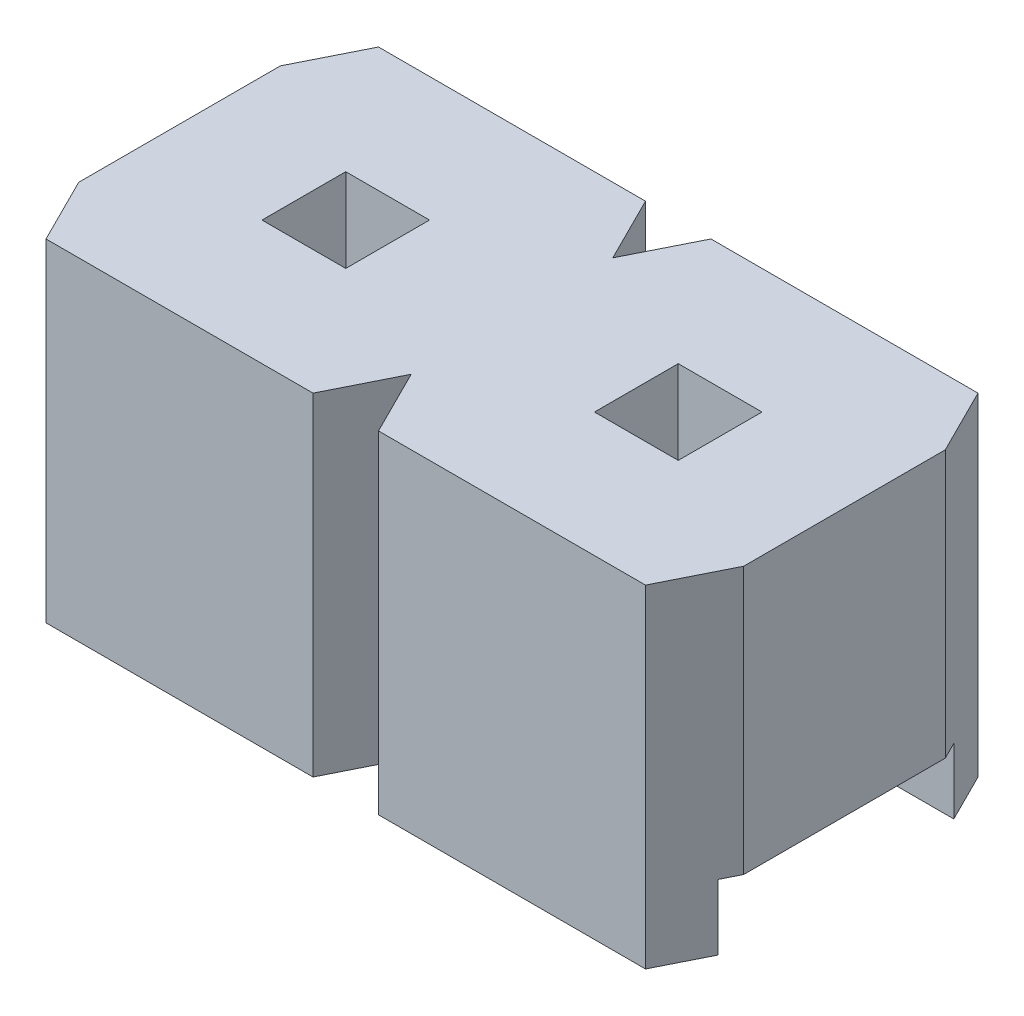
ISO-10303-21;
HEADER;
FILE_DESCRIPTION(('STEP AP214'),'2;1');
FILE_NAME('part.step','',(''),(''),'','','');
FILE_SCHEMA(('AUTOMOTIVE_DESIGN { 1 0 10303 214 1 1 1 1 }'));
ENDSEC;
DATA;
#1=APPLICATION_CONTEXT('core data for automotive mechanical design processes');
#2=APPLICATION_PROTOCOL_DEFINITION('international standard','automotive_design',2000,#1);
#3=PRODUCT_CONTEXT('',#1,'mechanical');
#4=PRODUCT('Part','Part','',(#3));
#5=PRODUCT_RELATED_PRODUCT_CATEGORY('part','',(#4));
#6=PRODUCT_DEFINITION_FORMATION('','',#4);
#7=PRODUCT_DEFINITION_CONTEXT('part definition',#1,'design');
#8=PRODUCT_DEFINITION('design','',#6,#7);
#9=PRODUCT_DEFINITION_SHAPE('','',#8);
#10=(LENGTH_UNIT() NAMED_UNIT(*) SI_UNIT(.MILLI.,.METRE.));
#11=(NAMED_UNIT(*) PLANE_ANGLE_UNIT() SI_UNIT($,.RADIAN.));
#12=(NAMED_UNIT(*) SI_UNIT($,.STERADIAN.) SOLID_ANGLE_UNIT());
#13=UNCERTAINTY_MEASURE_WITH_UNIT(LENGTH_MEASURE(1.E-05),#10,'distance_accuracy_value','');
#14=(GEOMETRIC_REPRESENTATION_CONTEXT(3) GLOBAL_UNCERTAINTY_ASSIGNED_CONTEXT((#13)) GLOBAL_UNIT_ASSIGNED_CONTEXT((#10,
#11,#12)) REPRESENTATION_CONTEXT('',''));
#15=CARTESIAN_POINT('',(0.,0.,0.));
#16=DIRECTION('',(0.,0.,1.));
#17=DIRECTION('',(1.,0.,0.));
#18=AXIS2_PLACEMENT_3D('',#15,#16,#17);
#19=CARTESIAN_POINT('',(2.54,1.27,1.27));
#20=DIRECTION('',(0.,1.,0.));
#21=DIRECTION('',(0.,0.,1.));
#22=AXIS2_PLACEMENT_3D('',#19,#20,#21);
#23=PLANE('',#22);
#24=DIRECTION('',(1.,0.,0.));
#25=VECTOR('',#24,1.);
#26=CARTESIAN_POINT('',(-1.59,1.27,-0.32));
#27=LINE('',#26,#25);
#28=CARTESIAN_POINT('',(-1.59,1.27,-0.32));
#29=VERTEX_POINT('',#28);
#30=CARTESIAN_POINT('',(-0.95,1.27,-0.32));
#31=VERTEX_POINT('',#30);
#32=EDGE_CURVE('E11',#29,#31,#27,.T.);
#33=ORIENTED_EDGE('',*,*,#32,.T.);
#34=DIRECTION('',(0.,0.,1.));
#35=VECTOR('',#34,1.);
#36=CARTESIAN_POINT('',(-0.95,1.27,-0.32));
#37=LINE('',#36,#35);
#38=CARTESIAN_POINT('',(-0.95,1.27,0.32));
#39=VERTEX_POINT('',#38);
#40=EDGE_CURVE('E23',#31,#39,#37,.T.);
#41=ORIENTED_EDGE('',*,*,#40,.T.);
#42=DIRECTION('',(-1.,0.,0.));
#43=VECTOR('',#42,1.);
#44=CARTESIAN_POINT('',(-0.95,1.27,0.32));
#45=LINE('',#44,#43);
#46=CARTESIAN_POINT('',(-1.59,1.27,0.32));
#47=VERTEX_POINT('',#46);
#48=EDGE_CURVE('E441',#39,#47,#45,.T.);
#49=ORIENTED_EDGE('',*,*,#48,.T.);
#50=DIRECTION('',(0.,0.,-1.));
#51=VECTOR('',#50,1.);
#52=CARTESIAN_POINT('',(-1.59,1.27,0.32));
#53=LINE('',#52,#51);
#54=EDGE_CURVE('E439',#47,#29,#53,.T.);
#55=ORIENTED_EDGE('',*,*,#54,.T.);
#56=EDGE_LOOP('',(#33,#41,#49,#55));
#57=FACE_BOUND('',#56,.T.);
#58=DIRECTION('',(0.,0.,-1.));
#59=VECTOR('',#58,1.);
#60=CARTESIAN_POINT('',(2.54,1.27,1.27));
#61=LINE('',#60,#59);
#62=CARTESIAN_POINT('',(2.54,1.27,0.77));
#63=VERTEX_POINT('',#62);
#64=CARTESIAN_POINT('',(2.54,1.27,-0.77));
#65=VERTEX_POINT('',#64);
#66=EDGE_CURVE('E437',#63,#65,#61,.T.);
#67=ORIENTED_EDGE('',*,*,#66,.T.);
#68=DIRECTION('',(-0.447213595499958,0.,-0.894427190999916));
#69=VECTOR('',#68,1.);
#70=CARTESIAN_POINT('',(2.54,1.27,-0.77));
#71=LINE('',#70,#69);
#72=CARTESIAN_POINT('',(2.29,1.27,-1.27));
#73=VERTEX_POINT('',#72);
#74=EDGE_CURVE('E435',#65,#73,#71,.T.);
#75=ORIENTED_EDGE('',*,*,#74,.T.);
#76=DIRECTION('',(-1.,0.,0.));
#77=VECTOR('',#76,1.);
#78=CARTESIAN_POINT('',(2.54,1.27,-1.27));
#79=LINE('',#78,#77);
#80=CARTESIAN_POINT('',(0.25,1.27,-1.27));
#81=VERTEX_POINT('',#80);
#82=EDGE_CURVE('E433',#73,#81,#79,.T.);
#83=ORIENTED_EDGE('',*,*,#82,.T.);
#84=DIRECTION('',(-0.447213595499958,0.,0.894427190999916));
#85=VECTOR('',#84,1.);
#86=CARTESIAN_POINT('',(0.25,1.27,-1.27));
#87=LINE('',#86,#85);
#88=CARTESIAN_POINT('',(0.,1.27,-0.77));
#89=VERTEX_POINT('',#88);
#90=EDGE_CURVE('E431',#81,#89,#87,.T.);
#91=ORIENTED_EDGE('',*,*,#90,.T.);
#92=DIRECTION('',(-0.447213595499958,0.,-0.894427190999916));
#93=VECTOR('',#92,1.);
#94=CARTESIAN_POINT('',(0.,1.27,-0.77));
#95=LINE('',#94,#93);
#96=CARTESIAN_POINT('',(-0.25,1.27,-1.27));
#97=VERTEX_POINT('',#96);
#98=EDGE_CURVE('E429',#89,#97,#95,.T.);
#99=ORIENTED_EDGE('',*,*,#98,.T.);
#100=DIRECTION('',(-1.,0.,0.));
#101=VECTOR('',#100,1.);
#102=CARTESIAN_POINT('',(2.54,1.27,-1.27));
#103=LINE('',#102,#101);
#104=CARTESIAN_POINT('',(-2.29,1.27,-1.27));
#105=VERTEX_POINT('',#104);
#106=EDGE_CURVE('E427',#97,#105,#103,.T.);
#107=ORIENTED_EDGE('',*,*,#106,.T.);
#108=DIRECTION('',(-0.447213595499958,0.,0.894427190999916));
#109=VECTOR('',#108,1.);
#110=CARTESIAN_POINT('',(-2.29,1.27,-1.27));
#111=LINE('',#110,#109);
#112=CARTESIAN_POINT('',(-2.54,1.27,-0.77));
#113=VERTEX_POINT('',#112);
#114=EDGE_CURVE('E425',#105,#113,#111,.T.);
#115=ORIENTED_EDGE('',*,*,#114,.T.);
#116=DIRECTION('',(0.,0.,-1.));
#117=VECTOR('',#116,1.);
#118=CARTESIAN_POINT('',(-2.54,1.27,1.27));
#119=LINE('',#118,#117);
#120=CARTESIAN_POINT('',(-2.54,1.27,0.77));
#121=VERTEX_POINT('',#120);
#122=EDGE_CURVE('E422',#121,#113,#119,.T.);
#123=ORIENTED_EDGE('',*,*,#122,.F.);
#124=DIRECTION('',(0.447213595499958,0.,0.894427190999916));
#125=VECTOR('',#124,1.);
#126=CARTESIAN_POINT('',(-2.54,1.27,0.77));
#127=LINE('',#126,#125);
#128=CARTESIAN_POINT('',(-2.29,1.27,1.27));
#129=VERTEX_POINT('',#128);
#130=EDGE_CURVE('E420',#121,#129,#127,.T.);
#131=ORIENTED_EDGE('',*,*,#130,.T.);
#132=DIRECTION('',(-1.,0.,0.));
#133=VECTOR('',#132,1.);
#134=CARTESIAN_POINT('',(2.54,1.27,1.27));
#135=LINE('',#134,#133);
#136=CARTESIAN_POINT('',(-0.25,1.27,1.27));
#137=VERTEX_POINT('',#136);
#138=EDGE_CURVE('E417',#137,#129,#135,.T.);
#139=ORIENTED_EDGE('',*,*,#138,.F.);
#140=DIRECTION('',(0.447213595499958,0.,-0.894427190999916));
#141=VECTOR('',#140,1.);
#142=CARTESIAN_POINT('',(-0.25,1.27,1.27));
#143=LINE('',#142,#141);
#144=CARTESIAN_POINT('',(0.,1.27,0.77));
#145=VERTEX_POINT('',#144);
#146=EDGE_CURVE('E415',#137,#145,#143,.T.);
#147=ORIENTED_EDGE('',*,*,#146,.T.);
#148=DIRECTION('',(0.447213595499958,0.,0.894427190999916));
#149=VECTOR('',#148,1.);
#150=CARTESIAN_POINT('',(0.,1.27,0.77));
#151=LINE('',#150,#149);
#152=CARTESIAN_POINT('',(0.25,1.27,1.27));
#153=VERTEX_POINT('',#152);
#154=EDGE_CURVE('E413',#145,#153,#151,.T.);
#155=ORIENTED_EDGE('',*,*,#154,.T.);
#156=DIRECTION('',(-1.,0.,0.));
#157=VECTOR('',#156,1.);
#158=CARTESIAN_POINT('',(2.54,1.27,1.27));
#159=LINE('',#158,#157);
#160=CARTESIAN_POINT('',(2.29,1.27,1.27));
#161=VERTEX_POINT('',#160);
#162=EDGE_CURVE('E410',#161,#153,#159,.T.);
#163=ORIENTED_EDGE('',*,*,#162,.F.);
#164=DIRECTION('',(0.447213595499958,0.,-0.894427190999916));
#165=VECTOR('',#164,1.);
#166=CARTESIAN_POINT('',(2.29,1.27,1.27));
#167=LINE('',#166,#165);
#168=EDGE_CURVE('E407',#161,#63,#167,.T.);
#169=ORIENTED_EDGE('',*,*,#168,.T.);
#170=EDGE_LOOP('',(#67,#75,#83,#91,#99,#107,#115,#123,#131,#139,#147,#155,#163,#169));
#171=FACE_BOUND('',#170,.T.);
#172=DIRECTION('',(1.,0.,0.));
#173=VECTOR('',#172,1.);
#174=CARTESIAN_POINT('',(0.95,1.27,-0.32));
#175=LINE('',#174,#173);
#176=CARTESIAN_POINT('',(0.95,1.27,-0.32));
#177=VERTEX_POINT('',#176);
#178=CARTESIAN_POINT('',(1.59,1.27,-0.32));
#179=VERTEX_POINT('',#178);
#180=EDGE_CURVE('E405',#177,#179,#175,.T.);
#181=ORIENTED_EDGE('',*,*,#180,.T.);
#182=DIRECTION('',(0.,0.,1.));
#183=VECTOR('',#182,1.);
#184=CARTESIAN_POINT('',(1.59,1.27,-0.32));
#185=LINE('',#184,#183);
#186=CARTESIAN_POINT('',(1.59,1.27,0.32));
#187=VERTEX_POINT('',#186);
#188=EDGE_CURVE('E403',#179,#187,#185,.T.);
#189=ORIENTED_EDGE('',*,*,#188,.T.);
#190=DIRECTION('',(-1.,0.,0.));
#191=VECTOR('',#190,1.);
#192=CARTESIAN_POINT('',(1.59,1.27,0.32));
#193=LINE('',#192,#191);
#194=CARTESIAN_POINT('',(0.95,1.27,0.32));
#195=VERTEX_POINT('',#194);
#196=EDGE_CURVE('E401',#187,#195,#193,.T.);
#197=ORIENTED_EDGE('',*,*,#196,.T.);
#198=DIRECTION('',(0.,0.,-1.));
#199=VECTOR('',#198,1.);
#200=CARTESIAN_POINT('',(0.95,1.27,0.32));
#201=LINE('',#200,#199);
#202=EDGE_CURVE('E398',#195,#177,#201,.T.);
#203=ORIENTED_EDGE('',*,*,#202,.T.);
#204=EDGE_LOOP('',(#181,#189,#197,#203));
#205=FACE_BOUND('',#204,.T.);
#206=ADVANCED_FACE('F16',(#57,#171,#205),#23,.T.);
#207=CARTESIAN_POINT('',(1.59,-4.95170394666927,0.32));
#208=DIRECTION('',(0.,0.,-1.));
#209=DIRECTION('',(-1.,0.,0.));
#210=AXIS2_PLACEMENT_3D('',#207,#208,#209);
#211=PLANE('',#210);
#212=DIRECTION('',(0.,1.,0.));
#213=VECTOR('',#212,1.);
#214=CARTESIAN_POINT('',(0.95,-4.95170394666927,0.32));
#215=LINE('',#214,#213);
#216=CARTESIAN_POINT('',(0.95,-0.77,0.32));
#217=VERTEX_POINT('',#216);
#218=EDGE_CURVE('E395',#217,#195,#215,.T.);
#219=ORIENTED_EDGE('',*,*,#218,.T.);
#220=ORIENTED_EDGE('',*,*,#196,.F.);
#221=DIRECTION('',(0.,1.,0.));
#222=VECTOR('',#221,1.);
#223=CARTESIAN_POINT('',(1.59,-4.95170394666927,0.32));
#224=LINE('',#223,#222);
#225=CARTESIAN_POINT('',(1.59,-0.77,0.32));
#226=VERTEX_POINT('',#225);
#227=EDGE_CURVE('E392',#226,#187,#224,.T.);
#228=ORIENTED_EDGE('',*,*,#227,.F.);
#229=DIRECTION('',(1.,0.,0.));
#230=VECTOR('',#229,1.);
#231=CARTESIAN_POINT('',(-3.68170394666927,-0.77,0.32));
#232=LINE('',#231,#230);
#233=EDGE_CURVE('E389',#217,#226,#232,.T.);
#234=ORIENTED_EDGE('',*,*,#233,.F.);
#235=EDGE_LOOP('',(#219,#220,#228,#234));
#236=FACE_BOUND('',#235,.T.);
#237=ADVANCED_FACE('F486',(#236),#211,.T.);
#238=CARTESIAN_POINT('',(0.95,-4.95170394666927,0.32));
#239=DIRECTION('',(1.,0.,0.));
#240=DIRECTION('',(0.,0.,-1.));
#241=AXIS2_PLACEMENT_3D('',#238,#239,#240);
#242=PLANE('',#241);
#243=DIRECTION('',(0.,1.,0.));
#244=VECTOR('',#243,1.);
#245=CARTESIAN_POINT('',(0.95,-4.95170394666927,-0.32));
#246=LINE('',#245,#244);
#247=CARTESIAN_POINT('',(0.95,-0.77,-0.32));
#248=VERTEX_POINT('',#247);
#249=EDGE_CURVE('E386',#248,#177,#246,.T.);
#250=ORIENTED_EDGE('',*,*,#249,.T.);
#251=ORIENTED_EDGE('',*,*,#202,.F.);
#252=ORIENTED_EDGE('',*,*,#218,.F.);
#253=DIRECTION('',(0.,0.,1.));
#254=VECTOR('',#253,1.);
#255=CARTESIAN_POINT('',(0.95,-0.77,0.9));
#256=LINE('',#255,#254);
#257=EDGE_CURVE('E383',#248,#217,#256,.T.);
#258=ORIENTED_EDGE('',*,*,#257,.F.);
#259=EDGE_LOOP('',(#250,#251,#252,#258));
#260=FACE_BOUND('',#259,.T.);
#261=ADVANCED_FACE('F470',(#260),#242,.T.);
#262=CARTESIAN_POINT('',(-3.68170394666927,-0.77,0.9));
#263=DIRECTION('',(0.,-1.,0.));
#264=DIRECTION('',(0.,0.,-1.));
#265=AXIS2_PLACEMENT_3D('',#262,#263,#264);
#266=PLANE('',#265);
#267=DIRECTION('',(1.,0.,0.));
#268=VECTOR('',#267,1.);
#269=CARTESIAN_POINT('',(-3.68170394666927,-0.77,0.9));
#270=LINE('',#269,#268);
#271=CARTESIAN_POINT('',(-2.475,-0.77,0.9));
#272=VERTEX_POINT('',#271);
#273=CARTESIAN_POINT('',(-0.065,-0.77,0.9));
#274=VERTEX_POINT('',#273);
#275=EDGE_CURVE('E381',#272,#274,#270,.T.);
#276=ORIENTED_EDGE('',*,*,#275,.F.);
#277=DIRECTION('',(0.447213595499958,0.,0.894427190999916));
#278=VECTOR('',#277,1.);
#279=CARTESIAN_POINT('',(-2.54,-0.77,0.77));
#280=LINE('',#279,#278);
#281=CARTESIAN_POINT('',(-2.54,-0.77,0.77));
#282=VERTEX_POINT('',#281);
#283=EDGE_CURVE('E378',#282,#272,#280,.T.);
#284=ORIENTED_EDGE('',*,*,#283,.F.);
#285=DIRECTION('',(0.,0.,1.));
#286=VECTOR('',#285,1.);
#287=CARTESIAN_POINT('',(-2.54,-0.77,0.));
#288=LINE('',#287,#286);
#289=CARTESIAN_POINT('',(-2.54,-0.77,-0.77));
#290=VERTEX_POINT('',#289);
#291=EDGE_CURVE('E375',#290,#282,#288,.T.);
#292=ORIENTED_EDGE('',*,*,#291,.F.);
#293=DIRECTION('',(-0.447213595499958,0.,0.894427190999916));
#294=VECTOR('',#293,1.);
#295=CARTESIAN_POINT('',(-2.29,-0.77,-1.27));
#296=LINE('',#295,#294);
#297=CARTESIAN_POINT('',(-2.475,-0.77,-0.9));
#298=VERTEX_POINT('',#297);
#299=EDGE_CURVE('E372',#298,#290,#296,.T.);
#300=ORIENTED_EDGE('',*,*,#299,.F.);
#301=DIRECTION('',(1.,0.,0.));
#302=VECTOR('',#301,1.);
#303=CARTESIAN_POINT('',(-3.68170394666927,-0.77,-0.9));
#304=LINE('',#303,#302);
#305=CARTESIAN_POINT('',(-0.065,-0.77,-0.9));
#306=VERTEX_POINT('',#305);
#307=EDGE_CURVE('E370',#298,#306,#304,.T.);
#308=ORIENTED_EDGE('',*,*,#307,.T.);
#309=DIRECTION('',(-0.447213595499958,0.,-0.894427190999916));
#310=VECTOR('',#309,1.);
#311=CARTESIAN_POINT('',(0.,-0.77,-0.77));
#312=LINE('',#311,#310);
#313=CARTESIAN_POINT('',(0.,-0.77,-0.77));
#314=VERTEX_POINT('',#313);
#315=EDGE_CURVE('E367',#314,#306,#312,.T.);
#316=ORIENTED_EDGE('',*,*,#315,.F.);
#317=DIRECTION('',(-0.447213595499958,0.,0.894427190999916));
#318=VECTOR('',#317,1.);
#319=CARTESIAN_POINT('',(0.25,-0.77,-1.27));
#320=LINE('',#319,#318);
#321=CARTESIAN_POINT('',(0.065,-0.77,-0.9));
#322=VERTEX_POINT('',#321);
#323=EDGE_CURVE('E364',#322,#314,#320,.T.);
#324=ORIENTED_EDGE('',*,*,#323,.F.);
#325=DIRECTION('',(1.,0.,0.));
#326=VECTOR('',#325,1.);
#327=CARTESIAN_POINT('',(-3.68170394666927,-0.77,-0.9));
#328=LINE('',#327,#326);
#329=CARTESIAN_POINT('',(2.475,-0.77,-0.9));
#330=VERTEX_POINT('',#329);
#331=EDGE_CURVE('E362',#322,#330,#328,.T.);
#332=ORIENTED_EDGE('',*,*,#331,.T.);
#333=DIRECTION('',(-0.447213595499958,0.,-0.894427190999916));
#334=VECTOR('',#333,1.);
#335=CARTESIAN_POINT('',(2.54,-0.77,-0.77));
#336=LINE('',#335,#334);
#337=CARTESIAN_POINT('',(2.54,-0.77,-0.77));
#338=VERTEX_POINT('',#337);
#339=EDGE_CURVE('E359',#338,#330,#336,.T.);
#340=ORIENTED_EDGE('',*,*,#339,.F.);
#341=DIRECTION('',(0.,0.,-1.));
#342=VECTOR('',#341,1.);
#343=CARTESIAN_POINT('',(2.54,-0.77,0.9));
#344=LINE('',#343,#342);
#345=CARTESIAN_POINT('',(2.54,-0.77,0.77));
#346=VERTEX_POINT('',#345);
#347=EDGE_CURVE('E356',#346,#338,#344,.T.);
#348=ORIENTED_EDGE('',*,*,#347,.F.);
#349=DIRECTION('',(0.447213595499958,0.,-0.894427190999916));
#350=VECTOR('',#349,1.);
#351=CARTESIAN_POINT('',(2.29,-0.77,1.27));
#352=LINE('',#351,#350);
#353=CARTESIAN_POINT('',(2.475,-0.77,0.9));
#354=VERTEX_POINT('',#353);
#355=EDGE_CURVE('E354',#354,#346,#352,.T.);
#356=ORIENTED_EDGE('',*,*,#355,.F.);
#357=DIRECTION('',(1.,0.,0.));
#358=VECTOR('',#357,1.);
#359=CARTESIAN_POINT('',(-3.68170394666927,-0.77,0.9));
#360=LINE('',#359,#358);
#361=CARTESIAN_POINT('',(0.0649999999999982,-0.77,0.9));
#362=VERTEX_POINT('',#361);
#363=EDGE_CURVE('E228',#362,#354,#360,.T.);
#364=ORIENTED_EDGE('',*,*,#363,.F.);
#365=DIRECTION('',(0.447213595499958,0.,0.894427190999916));
#366=VECTOR('',#365,1.);
#367=CARTESIAN_POINT('',(0.,-0.77,0.77));
#368=LINE('',#367,#366);
#369=CARTESIAN_POINT('',(0.,-0.77,0.77));
#370=VERTEX_POINT('',#369);
#371=EDGE_CURVE('E350',#370,#362,#368,.T.);
#372=ORIENTED_EDGE('',*,*,#371,.F.);
#373=DIRECTION('',(0.447213595499958,0.,-0.894427190999916));
#374=VECTOR('',#373,1.);
#375=CARTESIAN_POINT('',(-0.25,-0.77,1.27));
#376=LINE('',#375,#374);
#377=EDGE_CURVE('E347',#274,#370,#376,.T.);
#378=ORIENTED_EDGE('',*,*,#377,.F.);
#379=EDGE_LOOP('',(#276,#284,#292,#300,#308,#316,#324,#332,#340,#348,#356,#364,#372,#378));
#380=FACE_BOUND('',#379,.T.);
#381=DIRECTION('',(1.,0.,0.));
#382=VECTOR('',#381,1.);
#383=CARTESIAN_POINT('',(-1.59,-0.77,-0.32));
#384=LINE('',#383,#382);
#385=CARTESIAN_POINT('',(-1.59,-0.77,-0.32));
#386=VERTEX_POINT('',#385);
#387=CARTESIAN_POINT('',(-0.95,-0.77,-0.32));
#388=VERTEX_POINT('',#387);
#389=EDGE_CURVE('E345',#386,#388,#384,.T.);
#390=ORIENTED_EDGE('',*,*,#389,.F.);
#391=DIRECTION('',(0.,0.,-1.));
#392=VECTOR('',#391,1.);
#393=CARTESIAN_POINT('',(-1.59,-0.77,0.32));
#394=LINE('',#393,#392);
#395=CARTESIAN_POINT('',(-1.59,-0.77,0.32));
#396=VERTEX_POINT('',#395);
#397=EDGE_CURVE('E342',#396,#386,#394,.T.);
#398=ORIENTED_EDGE('',*,*,#397,.F.);
#399=DIRECTION('',(-1.,0.,0.));
#400=VECTOR('',#399,1.);
#401=CARTESIAN_POINT('',(-0.95,-0.77,0.32));
#402=LINE('',#401,#400);
#403=CARTESIAN_POINT('',(-0.95,-0.77,0.32));
#404=VERTEX_POINT('',#403);
#405=EDGE_CURVE('E339',#404,#396,#402,.T.);
#406=ORIENTED_EDGE('',*,*,#405,.F.);
#407=DIRECTION('',(0.,0.,1.));
#408=VECTOR('',#407,1.);
#409=CARTESIAN_POINT('',(-0.95,-0.77,-0.32));
#410=LINE('',#409,#408);
#411=EDGE_CURVE('E336',#388,#404,#410,.T.);
#412=ORIENTED_EDGE('',*,*,#411,.F.);
#413=EDGE_LOOP('',(#390,#398,#406,#412));
#414=FACE_BOUND('',#413,.T.);
#415=ORIENTED_EDGE('',*,*,#233,.T.);
#416=DIRECTION('',(0.,0.,-1.));
#417=VECTOR('',#416,1.);
#418=CARTESIAN_POINT('',(1.59,-0.77,0.9));
#419=LINE('',#418,#417);
#420=CARTESIAN_POINT('',(1.59,-0.77,-0.32));
#421=VERTEX_POINT('',#420);
#422=EDGE_CURVE('E334',#226,#421,#419,.T.);
#423=ORIENTED_EDGE('',*,*,#422,.T.);
#424=DIRECTION('',(-1.,0.,0.));
#425=VECTOR('',#424,1.);
#426=CARTESIAN_POINT('',(-3.68170394666927,-0.77,-0.32));
#427=LINE('',#426,#425);
#428=EDGE_CURVE('E331',#421,#248,#427,.T.);
#429=ORIENTED_EDGE('',*,*,#428,.T.);
#430=ORIENTED_EDGE('',*,*,#257,.T.);
#431=EDGE_LOOP('',(#415,#423,#429,#430));
#432=FACE_BOUND('',#431,.T.);
#433=ADVANCED_FACE('F466',(#380,#414,#432),#266,.T.);
#434=CARTESIAN_POINT('',(0.95,-4.95170394666927,-0.32));
#435=DIRECTION('',(0.,0.,1.));
#436=DIRECTION('',(1.,0.,0.));
#437=AXIS2_PLACEMENT_3D('',#434,#435,#436);
#438=PLANE('',#437);
#439=DIRECTION('',(0.,1.,0.));
#440=VECTOR('',#439,1.);
#441=CARTESIAN_POINT('',(1.59,-4.95170394666927,-0.32));
#442=LINE('',#441,#440);
#443=EDGE_CURVE('E328',#421,#179,#442,.T.);
#444=ORIENTED_EDGE('',*,*,#443,.T.);
#445=ORIENTED_EDGE('',*,*,#180,.F.);
#446=ORIENTED_EDGE('',*,*,#249,.F.);
#447=ORIENTED_EDGE('',*,*,#428,.F.);
#448=EDGE_LOOP('',(#444,#445,#446,#447));
#449=FACE_BOUND('',#448,.T.);
#450=ADVANCED_FACE('F469',(#449),#438,.T.);
#451=CARTESIAN_POINT('',(1.59,-4.95170394666927,-0.32));
#452=DIRECTION('',(-1.,0.,0.));
#453=DIRECTION('',(0.,0.,1.));
#454=AXIS2_PLACEMENT_3D('',#451,#452,#453);
#455=PLANE('',#454);
#456=ORIENTED_EDGE('',*,*,#227,.T.);
#457=ORIENTED_EDGE('',*,*,#188,.F.);
#458=ORIENTED_EDGE('',*,*,#443,.F.);
#459=ORIENTED_EDGE('',*,*,#422,.F.);
#460=EDGE_LOOP('',(#456,#457,#458,#459));
#461=FACE_BOUND('',#460,.T.);
#462=ADVANCED_FACE('F480',(#461),#455,.T.);
#463=CARTESIAN_POINT('',(-3.68170394666927,-0.77,-0.9));
#464=DIRECTION('',(0.,0.,1.));
#465=DIRECTION('',(0.,-1.,0.));
#466=AXIS2_PLACEMENT_3D('',#463,#464,#465);
#467=PLANE('',#466);
#468=DIRECTION('',(1.,0.,0.));
#469=VECTOR('',#468,1.);
#470=CARTESIAN_POINT('',(-3.68170394666927,-1.27,-0.9));
#471=LINE('',#470,#469);
#472=CARTESIAN_POINT('',(0.065,-1.27,-0.9));
#473=VERTEX_POINT('',#472);
#474=CARTESIAN_POINT('',(2.475,-1.27,-0.9));
#475=VERTEX_POINT('',#474);
#476=EDGE_CURVE('E326',#473,#475,#471,.T.);
#477=ORIENTED_EDGE('',*,*,#476,.T.);
#478=DIRECTION('',(0.,-1.,0.));
#479=VECTOR('',#478,1.);
#480=CARTESIAN_POINT('',(2.475,-5.15744894962224,-0.9));
#481=LINE('',#480,#479);
#482=EDGE_CURVE('E323',#330,#475,#481,.T.);
#483=ORIENTED_EDGE('',*,*,#482,.F.);
#484=ORIENTED_EDGE('',*,*,#331,.F.);
#485=DIRECTION('',(0.,1.,0.));
#486=VECTOR('',#485,1.);
#487=CARTESIAN_POINT('',(0.0650000000000022,-4.95170394666928,-0.9));
#488=LINE('',#487,#486);
#489=EDGE_CURVE('E320',#473,#322,#488,.T.);
#490=ORIENTED_EDGE('',*,*,#489,.F.);
#491=EDGE_LOOP('',(#477,#483,#484,#490));
#492=FACE_BOUND('',#491,.T.);
#493=ADVANCED_FACE('F502',(#492),#467,.T.);
#494=CARTESIAN_POINT('',(-3.68170394666927,-0.77,-0.9));
#495=DIRECTION('',(0.,0.,1.));
#496=DIRECTION('',(0.,-1.,0.));
#497=AXIS2_PLACEMENT_3D('',#494,#495,#496);
#498=PLANE('',#497);
#499=DIRECTION('',(1.,0.,0.));
#500=VECTOR('',#499,1.);
#501=CARTESIAN_POINT('',(-3.68170394666927,-1.27,-0.9));
#502=LINE('',#501,#500);
#503=CARTESIAN_POINT('',(-2.475,-1.27,-0.9));
#504=VERTEX_POINT('',#503);
#505=CARTESIAN_POINT('',(-0.065,-1.27,-0.9));
#506=VERTEX_POINT('',#505);
#507=EDGE_CURVE('E318',#504,#506,#502,.T.);
#508=ORIENTED_EDGE('',*,*,#507,.T.);
#509=DIRECTION('',(0.,-1.,0.));
#510=VECTOR('',#509,1.);
#511=CARTESIAN_POINT('',(-0.0650000000000023,-4.95170394666927,-0.9));
#512=LINE('',#511,#510);
#513=EDGE_CURVE('E315',#306,#506,#512,.T.);
#514=ORIENTED_EDGE('',*,*,#513,.F.);
#515=ORIENTED_EDGE('',*,*,#307,.F.);
#516=DIRECTION('',(0.,1.,0.));
#517=VECTOR('',#516,1.);
#518=CARTESIAN_POINT('',(-2.475,-5.15744894962224,-0.9));
#519=LINE('',#518,#517);
#520=EDGE_CURVE('E312',#504,#298,#519,.T.);
#521=ORIENTED_EDGE('',*,*,#520,.F.);
#522=EDGE_LOOP('',(#508,#514,#515,#521));
#523=FACE_BOUND('',#522,.T.);
#524=ADVANCED_FACE('F505',(#523),#498,.T.);
#525=CARTESIAN_POINT('',(2.54,-1.27,-1.27));
#526=DIRECTION('',(0.,-1.,0.));
#527=DIRECTION('',(0.,0.,-1.));
#528=AXIS2_PLACEMENT_3D('',#525,#526,#527);
#529=PLANE('',#528);
#530=DIRECTION('',(-0.447213595499958,0.,-0.894427190999916));
#531=VECTOR('',#530,1.);
#532=CARTESIAN_POINT('',(-2.34,-1.27,1.17));
#533=LINE('',#532,#531);
#534=CARTESIAN_POINT('',(-2.29,-1.27,1.27));
#535=VERTEX_POINT('',#534);
#536=CARTESIAN_POINT('',(-2.475,-1.27,0.9));
#537=VERTEX_POINT('',#536);
#538=EDGE_CURVE('E310',#535,#537,#533,.T.);
#539=ORIENTED_EDGE('',*,*,#538,.T.);
#540=DIRECTION('',(1.,0.,0.));
#541=VECTOR('',#540,1.);
#542=CARTESIAN_POINT('',(-3.68170394666927,-1.27,0.9));
#543=LINE('',#542,#541);
#544=CARTESIAN_POINT('',(-0.065,-1.27,0.9));
#545=VERTEX_POINT('',#544);
#546=EDGE_CURVE('E308',#537,#545,#543,.T.);
#547=ORIENTED_EDGE('',*,*,#546,.T.);
#548=DIRECTION('',(-0.447213595499958,0.,0.894427190999916));
#549=VECTOR('',#548,1.);
#550=CARTESIAN_POINT('',(1.324,-1.27,-1.878));
#551=LINE('',#550,#549);
#552=CARTESIAN_POINT('',(-0.25,-1.27,1.27));
#553=VERTEX_POINT('',#552);
#554=EDGE_CURVE('E306',#545,#553,#551,.T.);
#555=ORIENTED_EDGE('',*,*,#554,.T.);
#556=DIRECTION('',(-1.,0.,0.));
#557=VECTOR('',#556,1.);
#558=CARTESIAN_POINT('',(2.54,-1.27,1.27));
#559=LINE('',#558,#557);
#560=EDGE_CURVE('E303',#553,#535,#559,.T.);
#561=ORIENTED_EDGE('',*,*,#560,.T.);
#562=EDGE_LOOP('',(#539,#547,#555,#561));
#563=FACE_BOUND('',#562,.T.);
#564=ADVANCED_FACE('F509',(#563),#529,.T.);
#565=CARTESIAN_POINT('',(2.54,0.,0.));
#566=DIRECTION('',(-1.,0.,0.));
#567=DIRECTION('',(0.,0.,1.));
#568=AXIS2_PLACEMENT_3D('',#565,#566,#567);
#569=PLANE('',#568);
#570=ORIENTED_EDGE('',*,*,#347,.T.);
#571=DIRECTION('',(0.,-1.,0.));
#572=VECTOR('',#571,1.);
#573=CARTESIAN_POINT('',(2.54,0.,-0.77));
#574=LINE('',#573,#572);
#575=EDGE_CURVE('E300',#65,#338,#574,.T.);
#576=ORIENTED_EDGE('',*,*,#575,.F.);
#577=ORIENTED_EDGE('',*,*,#66,.F.);
#578=DIRECTION('',(0.,1.,0.));
#579=VECTOR('',#578,1.);
#580=CARTESIAN_POINT('',(2.54,0.,0.77));
#581=LINE('',#580,#579);
#582=EDGE_CURVE('E297',#346,#63,#581,.T.);
#583=ORIENTED_EDGE('',*,*,#582,.F.);
#584=EDGE_LOOP('',(#570,#576,#577,#583));
#585=FACE_BOUND('',#584,.T.);
#586=ADVANCED_FACE('F513',(#585),#569,.F.);
#587=CARTESIAN_POINT('',(2.54,-5.15744894962224,-0.77));
#588=DIRECTION('',(0.894427190999916,0.,-0.447213595499958));
#589=DIRECTION('',(-0.447213595499958,0.,-0.894427190999916));
#590=AXIS2_PLACEMENT_3D('',#587,#588,#589);
#591=PLANE('',#590);
#592=ORIENTED_EDGE('',*,*,#575,.T.);
#593=ORIENTED_EDGE('',*,*,#339,.T.);
#594=ORIENTED_EDGE('',*,*,#482,.T.);
#595=DIRECTION('',(0.447213595499958,0.,0.894427190999916));
#596=VECTOR('',#595,1.);
#597=CARTESIAN_POINT('',(2.34,-1.27,-1.17));
#598=LINE('',#597,#596);
#599=CARTESIAN_POINT('',(2.29,-1.27,-1.27));
#600=VERTEX_POINT('',#599);
#601=EDGE_CURVE('E294',#600,#475,#598,.T.);
#602=ORIENTED_EDGE('',*,*,#601,.F.);
#603=DIRECTION('',(0.,1.,0.));
#604=VECTOR('',#603,1.);
#605=CARTESIAN_POINT('',(2.29,-5.15744894962224,-1.27));
#606=LINE('',#605,#604);
#607=EDGE_CURVE('E291',#600,#73,#606,.T.);
#608=ORIENTED_EDGE('',*,*,#607,.T.);
#609=ORIENTED_EDGE('',*,*,#74,.F.);
#610=EDGE_LOOP('',(#592,#593,#594,#602,#608,#609));
#611=FACE_BOUND('',#610,.T.);
#612=ADVANCED_FACE('F517',(#611),#591,.T.);
#613=CARTESIAN_POINT('',(2.54,1.27,-1.27));
#614=DIRECTION('',(0.,0.,-1.));
#615=DIRECTION('',(-1.,0.,0.));
#616=AXIS2_PLACEMENT_3D('',#613,#614,#615);
#617=PLANE('',#616);
#618=ORIENTED_EDGE('',*,*,#82,.F.);
#619=ORIENTED_EDGE('',*,*,#607,.F.);
#620=DIRECTION('',(-1.,0.,0.));
#621=VECTOR('',#620,1.);
#622=CARTESIAN_POINT('',(2.54,-1.27,-1.27));
#623=LINE('',#622,#621);
#624=CARTESIAN_POINT('',(0.25,-1.27,-1.27));
#625=VERTEX_POINT('',#624);
#626=EDGE_CURVE('E289',#600,#625,#623,.T.);
#627=ORIENTED_EDGE('',*,*,#626,.T.);
#628=DIRECTION('',(0.,1.,0.));
#629=VECTOR('',#628,1.);
#630=CARTESIAN_POINT('',(0.25,1.27,-1.27));
#631=LINE('',#630,#629);
#632=EDGE_CURVE('E286',#625,#81,#631,.T.);
#633=ORIENTED_EDGE('',*,*,#632,.T.);
#634=EDGE_LOOP('',(#618,#619,#627,#633));
#635=FACE_BOUND('',#634,.T.);
#636=ADVANCED_FACE('F521',(#635),#617,.T.);
#637=CARTESIAN_POINT('',(2.54,-1.27,-1.27));
#638=DIRECTION('',(0.,-1.,0.));
#639=DIRECTION('',(0.,0.,-1.));
#640=AXIS2_PLACEMENT_3D('',#637,#638,#639);
#641=PLANE('',#640);
#642=ORIENTED_EDGE('',*,*,#601,.T.);
#643=ORIENTED_EDGE('',*,*,#476,.F.);
#644=DIRECTION('',(0.447213595499958,0.,-0.894427190999916));
#645=VECTOR('',#644,1.);
#646=CARTESIAN_POINT('',(0.708,-1.27,-2.186));
#647=LINE('',#646,#645);
#648=EDGE_CURVE('E283',#473,#625,#647,.T.);
#649=ORIENTED_EDGE('',*,*,#648,.T.);
#650=ORIENTED_EDGE('',*,*,#626,.F.);
#651=EDGE_LOOP('',(#642,#643,#649,#650));
#652=FACE_BOUND('',#651,.T.);
#653=ADVANCED_FACE('F525',(#652),#641,.T.);
#654=CARTESIAN_POINT('',(0.25,-4.95170394666927,-1.27));
#655=DIRECTION('',(-0.894427190999916,0.,-0.447213595499958));
#656=DIRECTION('',(-0.447213595499958,0.,0.894427190999916));
#657=AXIS2_PLACEMENT_3D('',#654,#655,#656);
#658=PLANE('',#657);
#659=ORIENTED_EDGE('',*,*,#489,.T.);
#660=ORIENTED_EDGE('',*,*,#323,.T.);
#661=DIRECTION('',(0.,1.,0.));
#662=VECTOR('',#661,1.);
#663=CARTESIAN_POINT('',(0.,-4.95170394666927,-0.77));
#664=LINE('',#663,#662);
#665=EDGE_CURVE('E280',#314,#89,#664,.T.);
#666=ORIENTED_EDGE('',*,*,#665,.T.);
#667=ORIENTED_EDGE('',*,*,#90,.F.);
#668=ORIENTED_EDGE('',*,*,#632,.F.);
#669=ORIENTED_EDGE('',*,*,#648,.F.);
#670=EDGE_LOOP('',(#659,#660,#666,#667,#668,#669));
#671=FACE_BOUND('',#670,.T.);
#672=ADVANCED_FACE('F529',(#671),#658,.T.);
#673=CARTESIAN_POINT('',(2.54,1.27,-1.27));
#674=DIRECTION('',(0.,0.,-1.));
#675=DIRECTION('',(-1.,0.,0.));
#676=AXIS2_PLACEMENT_3D('',#673,#674,#675);
#677=PLANE('',#676);
#678=ORIENTED_EDGE('',*,*,#106,.F.);
#679=DIRECTION('',(0.,-1.,0.));
#680=VECTOR('',#679,1.);
#681=CARTESIAN_POINT('',(-0.25,1.27,-1.27));
#682=LINE('',#681,#680);
#683=CARTESIAN_POINT('',(-0.25,-1.27,-1.27));
#684=VERTEX_POINT('',#683);
#685=EDGE_CURVE('E278',#97,#684,#682,.T.);
#686=ORIENTED_EDGE('',*,*,#685,.T.);
#687=DIRECTION('',(-1.,0.,0.));
#688=VECTOR('',#687,1.);
#689=CARTESIAN_POINT('',(2.54,-1.27,-1.27));
#690=LINE('',#689,#688);
#691=CARTESIAN_POINT('',(-2.29,-1.27,-1.27));
#692=VERTEX_POINT('',#691);
#693=EDGE_CURVE('E276',#684,#692,#690,.T.);
#694=ORIENTED_EDGE('',*,*,#693,.T.);
#695=DIRECTION('',(0.,1.,0.));
#696=VECTOR('',#695,1.);
#697=CARTESIAN_POINT('',(-2.29,1.27,-1.27));
#698=LINE('',#697,#696);
#699=EDGE_CURVE('E273',#692,#105,#698,.T.);
#700=ORIENTED_EDGE('',*,*,#699,.T.);
#701=EDGE_LOOP('',(#678,#686,#694,#700));
#702=FACE_BOUND('',#701,.T.);
#703=ADVANCED_FACE('F533',(#702),#677,.T.);
#704=CARTESIAN_POINT('',(-2.29,-5.15744894962224,-1.27));
#705=DIRECTION('',(-0.894427190999916,0.,-0.447213595499958));
#706=DIRECTION('',(-0.447213595499958,0.,0.894427190999916));
#707=AXIS2_PLACEMENT_3D('',#704,#705,#706);
#708=PLANE('',#707);
#709=ORIENTED_EDGE('',*,*,#520,.T.);
#710=ORIENTED_EDGE('',*,*,#299,.T.);
#711=DIRECTION('',(0.,1.,0.));
#712=VECTOR('',#711,1.);
#713=CARTESIAN_POINT('',(-2.54,-5.15744894962224,-0.77));
#714=LINE('',#713,#712);
#715=EDGE_CURVE('E270',#290,#113,#714,.T.);
#716=ORIENTED_EDGE('',*,*,#715,.T.);
#717=ORIENTED_EDGE('',*,*,#114,.F.);
#718=ORIENTED_EDGE('',*,*,#699,.F.);
#719=DIRECTION('',(0.447213595499958,0.,-0.894427190999916));
#720=VECTOR('',#719,1.);
#721=CARTESIAN_POINT('',(-1.324,-1.27,-3.202));
#722=LINE('',#721,#720);
#723=EDGE_CURVE('E267',#504,#692,#722,.T.);
#724=ORIENTED_EDGE('',*,*,#723,.F.);
#725=EDGE_LOOP('',(#709,#710,#716,#717,#718,#724));
#726=FACE_BOUND('',#725,.T.);
#727=ADVANCED_FACE('F537',(#726),#708,.T.);
#728=CARTESIAN_POINT('',(-2.54,0.,0.));
#729=DIRECTION('',(-1.,0.,0.));
#730=DIRECTION('',(0.,0.,1.));
#731=AXIS2_PLACEMENT_3D('',#728,#729,#730);
#732=PLANE('',#731);
#733=ORIENTED_EDGE('',*,*,#715,.F.);
#734=ORIENTED_EDGE('',*,*,#291,.T.);
#735=DIRECTION('',(0.,1.,0.));
#736=VECTOR('',#735,1.);
#737=CARTESIAN_POINT('',(-2.54,0.,0.77));
#738=LINE('',#737,#736);
#739=EDGE_CURVE('E264',#282,#121,#738,.T.);
#740=ORIENTED_EDGE('',*,*,#739,.T.);
#741=ORIENTED_EDGE('',*,*,#122,.T.);
#742=EDGE_LOOP('',(#733,#734,#740,#741));
#743=FACE_BOUND('',#742,.T.);
#744=ADVANCED_FACE('F541',(#743),#732,.T.);
#745=CARTESIAN_POINT('',(-2.54,-5.15744894962224,0.77));
#746=DIRECTION('',(-0.894427190999916,0.,0.447213595499958));
#747=DIRECTION('',(0.447213595499958,0.,0.894427190999916));
#748=AXIS2_PLACEMENT_3D('',#745,#746,#747);
#749=PLANE('',#748);
#750=ORIENTED_EDGE('',*,*,#283,.T.);
#751=DIRECTION('',(0.,-1.,0.));
#752=VECTOR('',#751,1.);
#753=CARTESIAN_POINT('',(-2.475,-5.15744894962224,0.9));
#754=LINE('',#753,#752);
#755=EDGE_CURVE('E261',#272,#537,#754,.T.);
#756=ORIENTED_EDGE('',*,*,#755,.T.);
#757=ORIENTED_EDGE('',*,*,#538,.F.);
#758=DIRECTION('',(0.,1.,0.));
#759=VECTOR('',#758,1.);
#760=CARTESIAN_POINT('',(-2.29,-5.15744894962224,1.27));
#761=LINE('',#760,#759);
#762=EDGE_CURVE('E258',#535,#129,#761,.T.);
#763=ORIENTED_EDGE('',*,*,#762,.T.);
#764=ORIENTED_EDGE('',*,*,#130,.F.);
#765=ORIENTED_EDGE('',*,*,#739,.F.);
#766=EDGE_LOOP('',(#750,#756,#757,#763,#764,#765));
#767=FACE_BOUND('',#766,.T.);
#768=ADVANCED_FACE('F545',(#767),#749,.T.);
#769=CARTESIAN_POINT('',(2.54,-1.27,1.27));
#770=DIRECTION('',(0.,0.,1.));
#771=DIRECTION('',(0.,-1.,0.));
#772=AXIS2_PLACEMENT_3D('',#769,#770,#771);
#773=PLANE('',#772);
#774=ORIENTED_EDGE('',*,*,#560,.F.);
#775=DIRECTION('',(0.,1.,0.));
#776=VECTOR('',#775,1.);
#777=CARTESIAN_POINT('',(-0.25,-1.27,1.27));
#778=LINE('',#777,#776);
#779=EDGE_CURVE('E255',#553,#137,#778,.T.);
#780=ORIENTED_EDGE('',*,*,#779,.T.);
#781=ORIENTED_EDGE('',*,*,#138,.T.);
#782=ORIENTED_EDGE('',*,*,#762,.F.);
#783=EDGE_LOOP('',(#774,#780,#781,#782));
#784=FACE_BOUND('',#783,.T.);
#785=ADVANCED_FACE('F549',(#784),#773,.T.);
#786=CARTESIAN_POINT('',(-0.25,-4.95170394666927,1.27));
#787=DIRECTION('',(0.894427190999916,0.,0.447213595499958));
#788=DIRECTION('',(0.447213595499958,0.,-0.894427190999916));
#789=AXIS2_PLACEMENT_3D('',#786,#787,#788);
#790=PLANE('',#789);
#791=ORIENTED_EDGE('',*,*,#554,.F.);
#792=DIRECTION('',(0.,1.,0.));
#793=VECTOR('',#792,1.);
#794=CARTESIAN_POINT('',(-0.0650000000000014,-4.95170394666927,0.9));
#795=LINE('',#794,#793);
#796=EDGE_CURVE('E252',#545,#274,#795,.T.);
#797=ORIENTED_EDGE('',*,*,#796,.T.);
#798=ORIENTED_EDGE('',*,*,#377,.T.);
#799=DIRECTION('',(0.,1.,0.));
#800=VECTOR('',#799,1.);
#801=CARTESIAN_POINT('',(0.,-4.95170394666927,0.77));
#802=LINE('',#801,#800);
#803=EDGE_CURVE('E249',#370,#145,#802,.T.);
#804=ORIENTED_EDGE('',*,*,#803,.T.);
#805=ORIENTED_EDGE('',*,*,#146,.F.);
#806=ORIENTED_EDGE('',*,*,#779,.F.);
#807=EDGE_LOOP('',(#791,#797,#798,#804,#805,#806));
#808=FACE_BOUND('',#807,.T.);
#809=ADVANCED_FACE('F553',(#808),#790,.T.);
#810=CARTESIAN_POINT('',(0.,-4.95170394666927,0.77));
#811=DIRECTION('',(-0.894427190999916,0.,0.447213595499958));
#812=DIRECTION('',(0.447213595499958,0.,0.894427190999916));
#813=AXIS2_PLACEMENT_3D('',#810,#811,#812);
#814=PLANE('',#813);
#815=ORIENTED_EDGE('',*,*,#371,.T.);
#816=DIRECTION('',(0.,-1.,0.));
#817=VECTOR('',#816,1.);
#818=CARTESIAN_POINT('',(0.0650000000000014,-4.95170394666927,0.9));
#819=LINE('',#818,#817);
#820=CARTESIAN_POINT('',(0.065,-1.27,0.9));
#821=VERTEX_POINT('',#820);
#822=EDGE_CURVE('E247',#362,#821,#819,.T.);
#823=ORIENTED_EDGE('',*,*,#822,.T.);
#824=DIRECTION('',(-0.447213595499958,0.,-0.894427190999916));
#825=VECTOR('',#824,1.);
#826=CARTESIAN_POINT('',(-0.308,-1.27,0.153999999999998));
#827=LINE('',#826,#825);
#828=CARTESIAN_POINT('',(0.25,-1.27,1.27));
#829=VERTEX_POINT('',#828);
#830=EDGE_CURVE('E232',#829,#821,#827,.T.);
#831=ORIENTED_EDGE('',*,*,#830,.F.);
#832=DIRECTION('',(0.,-1.,0.));
#833=VECTOR('',#832,1.);
#834=CARTESIAN_POINT('',(0.25,-1.27,1.27));
#835=LINE('',#834,#833);
#836=EDGE_CURVE('E243',#153,#829,#835,.T.);
#837=ORIENTED_EDGE('',*,*,#836,.F.);
#838=ORIENTED_EDGE('',*,*,#154,.F.);
#839=ORIENTED_EDGE('',*,*,#803,.F.);
#840=EDGE_LOOP('',(#815,#823,#831,#837,#838,#839));
#841=FACE_BOUND('',#840,.T.);
#842=ADVANCED_FACE('F557',(#841),#814,.T.);
#843=CARTESIAN_POINT('',(2.54,-1.27,1.27));
#844=DIRECTION('',(0.,0.,1.));
#845=DIRECTION('',(0.,-1.,0.));
#846=AXIS2_PLACEMENT_3D('',#843,#844,#845);
#847=PLANE('',#846);
#848=DIRECTION('',(-1.,0.,0.));
#849=VECTOR('',#848,1.);
#850=CARTESIAN_POINT('',(2.54,-1.27,1.27));
#851=LINE('',#850,#849);
#852=CARTESIAN_POINT('',(2.29,-1.27,1.27));
#853=VERTEX_POINT('',#852);
#854=EDGE_CURVE('E241',#853,#829,#851,.T.);
#855=ORIENTED_EDGE('',*,*,#854,.F.);
#856=DIRECTION('',(0.,1.,0.));
#857=VECTOR('',#856,1.);
#858=CARTESIAN_POINT('',(2.29,-5.15744894962224,1.27));
#859=LINE('',#858,#857);
#860=EDGE_CURVE('E217',#853,#161,#859,.T.);
#861=ORIENTED_EDGE('',*,*,#860,.T.);
#862=ORIENTED_EDGE('',*,*,#162,.T.);
#863=ORIENTED_EDGE('',*,*,#836,.T.);
#864=EDGE_LOOP('',(#855,#861,#862,#863));
#865=FACE_BOUND('',#864,.T.);
#866=ADVANCED_FACE('F561',(#865),#847,.T.);
#867=CARTESIAN_POINT('',(2.29,-5.15744894962224,1.27));
#868=DIRECTION('',(0.894427190999916,0.,0.447213595499958));
#869=DIRECTION('',(0.447213595499958,0.,-0.894427190999916));
#870=AXIS2_PLACEMENT_3D('',#867,#868,#869);
#871=PLANE('',#870);
#872=DIRECTION('',(-0.447213595499958,0.,0.894427190999916));
#873=VECTOR('',#872,1.);
#874=CARTESIAN_POINT('',(3.356,-1.27,-0.862));
#875=LINE('',#874,#873);
#876=CARTESIAN_POINT('',(2.475,-1.27,0.9));
#877=VERTEX_POINT('',#876);
#878=EDGE_CURVE('E210',#877,#853,#875,.T.);
#879=ORIENTED_EDGE('',*,*,#878,.F.);
#880=DIRECTION('',(0.,1.,0.));
#881=VECTOR('',#880,1.);
#882=CARTESIAN_POINT('',(2.475,-5.15744894962224,0.9));
#883=LINE('',#882,#881);
#884=EDGE_CURVE('E214',#877,#354,#883,.T.);
#885=ORIENTED_EDGE('',*,*,#884,.T.);
#886=ORIENTED_EDGE('',*,*,#355,.T.);
#887=ORIENTED_EDGE('',*,*,#582,.T.);
#888=ORIENTED_EDGE('',*,*,#168,.F.);
#889=ORIENTED_EDGE('',*,*,#860,.F.);
#890=EDGE_LOOP('',(#879,#885,#886,#887,#888,#889));
#891=FACE_BOUND('',#890,.T.);
#892=ADVANCED_FACE('F212',(#891),#871,.T.);
#893=CARTESIAN_POINT('',(-3.68170394666927,-1.27,0.9));
#894=DIRECTION('',(0.,0.,-1.));
#895=DIRECTION('',(0.,1.,0.));
#896=AXIS2_PLACEMENT_3D('',#893,#894,#895);
#897=PLANE('',#896);
#898=ORIENTED_EDGE('',*,*,#363,.T.);
#899=ORIENTED_EDGE('',*,*,#884,.F.);
#900=DIRECTION('',(1.,0.,0.));
#901=VECTOR('',#900,1.);
#902=CARTESIAN_POINT('',(-3.68170394666927,-1.27,0.9));
#903=LINE('',#902,#901);
#904=EDGE_CURVE('E227',#821,#877,#903,.T.);
#905=ORIENTED_EDGE('',*,*,#904,.F.);
#906=ORIENTED_EDGE('',*,*,#822,.F.);
#907=EDGE_LOOP('',(#898,#899,#905,#906));
#908=FACE_BOUND('',#907,.T.);
#909=ADVANCED_FACE('F225',(#908),#897,.T.);
#910=CARTESIAN_POINT('',(2.54,-1.27,-1.27));
#911=DIRECTION('',(0.,-1.,0.));
#912=DIRECTION('',(0.,0.,-1.));
#913=AXIS2_PLACEMENT_3D('',#910,#911,#912);
#914=PLANE('',#913);
#915=ORIENTED_EDGE('',*,*,#830,.T.);
#916=ORIENTED_EDGE('',*,*,#904,.T.);
#917=ORIENTED_EDGE('',*,*,#878,.T.);
#918=ORIENTED_EDGE('',*,*,#854,.T.);
#919=EDGE_LOOP('',(#915,#916,#917,#918));
#920=FACE_BOUND('',#919,.T.);
#921=ADVANCED_FACE('F231',(#920),#914,.T.);
#922=CARTESIAN_POINT('',(2.54,-1.27,-1.27));
#923=DIRECTION('',(0.,-1.,0.));
#924=DIRECTION('',(0.,0.,-1.));
#925=AXIS2_PLACEMENT_3D('',#922,#923,#924);
#926=PLANE('',#925);
#927=DIRECTION('',(0.447213595499958,0.,0.894427190999916));
#928=VECTOR('',#927,1.);
#929=CARTESIAN_POINT('',(0.308,-1.27,-0.154));
#930=LINE('',#929,#928);
#931=EDGE_CURVE('E233',#684,#506,#930,.T.);
#932=ORIENTED_EDGE('',*,*,#931,.T.);
#933=ORIENTED_EDGE('',*,*,#507,.F.);
#934=ORIENTED_EDGE('',*,*,#723,.T.);
#935=ORIENTED_EDGE('',*,*,#693,.F.);
#936=EDGE_LOOP('',(#932,#933,#934,#935));
#937=FACE_BOUND('',#936,.T.);
#938=ADVANCED_FACE('F572',(#937),#926,.T.);
#939=CARTESIAN_POINT('',(-1.59,-4.95170394666927,-0.32));
#940=DIRECTION('',(0.,0.,1.));
#941=DIRECTION('',(1.,0.,0.));
#942=AXIS2_PLACEMENT_3D('',#939,#940,#941);
#943=PLANE('',#942);
#944=DIRECTION('',(0.,1.,0.));
#945=VECTOR('',#944,1.);
#946=CARTESIAN_POINT('',(-1.59,-4.95170394666927,-0.32));
#947=LINE('',#946,#945);
#948=EDGE_CURVE('E236',#386,#29,#947,.T.);
#949=ORIENTED_EDGE('',*,*,#948,.F.);
#950=ORIENTED_EDGE('',*,*,#389,.T.);
#951=DIRECTION('',(0.,1.,0.));
#952=VECTOR('',#951,1.);
#953=CARTESIAN_POINT('',(-0.95,-4.95170394666927,-0.32));
#954=LINE('',#953,#952);
#955=EDGE_CURVE('E458',#388,#31,#954,.T.);
#956=ORIENTED_EDGE('',*,*,#955,.T.);
#957=ORIENTED_EDGE('',*,*,#32,.F.);
#958=EDGE_LOOP('',(#949,#950,#956,#957));
#959=FACE_BOUND('',#958,.T.);
#960=ADVANCED_FACE('F464',(#959),#943,.T.);
#961=CARTESIAN_POINT('',(-1.59,-4.95170394666927,0.32));
#962=DIRECTION('',(1.,0.,0.));
#963=DIRECTION('',(0.,0.,-1.));
#964=AXIS2_PLACEMENT_3D('',#961,#962,#963);
#965=PLANE('',#964);
#966=DIRECTION('',(0.,1.,0.));
#967=VECTOR('',#966,1.);
#968=CARTESIAN_POINT('',(-1.59,-4.95170394666927,0.32));
#969=LINE('',#968,#967);
#970=EDGE_CURVE('E454',#396,#47,#969,.T.);
#971=ORIENTED_EDGE('',*,*,#970,.F.);
#972=ORIENTED_EDGE('',*,*,#397,.T.);
#973=ORIENTED_EDGE('',*,*,#948,.T.);
#974=ORIENTED_EDGE('',*,*,#54,.F.);
#975=EDGE_LOOP('',(#971,#972,#973,#974));
#976=FACE_BOUND('',#975,.T.);
#977=ADVANCED_FACE('F463',(#976),#965,.T.);
#978=CARTESIAN_POINT('',(-0.95,-4.95170394666927,0.32));
#979=DIRECTION('',(0.,0.,-1.));
#980=DIRECTION('',(-1.,0.,0.));
#981=AXIS2_PLACEMENT_3D('',#978,#979,#980);
#982=PLANE('',#981);
#983=DIRECTION('',(0.,1.,0.));
#984=VECTOR('',#983,1.);
#985=CARTESIAN_POINT('',(-0.95,-4.95170394666927,0.32));
#986=LINE('',#985,#984);
#987=EDGE_CURVE('E452',#404,#39,#986,.T.);
#988=ORIENTED_EDGE('',*,*,#987,.F.);
#989=ORIENTED_EDGE('',*,*,#405,.T.);
#990=ORIENTED_EDGE('',*,*,#970,.T.);
#991=ORIENTED_EDGE('',*,*,#48,.F.);
#992=EDGE_LOOP('',(#988,#989,#990,#991));
#993=FACE_BOUND('',#992,.T.);
#994=ADVANCED_FACE('F451',(#993),#982,.T.);
#995=CARTESIAN_POINT('',(-3.68170394666927,-1.27,0.9));
#996=DIRECTION('',(0.,0.,-1.));
#997=DIRECTION('',(0.,1.,0.));
#998=AXIS2_PLACEMENT_3D('',#995,#996,#997);
#999=PLANE('',#998);
#1000=ORIENTED_EDGE('',*,*,#275,.T.);
#1001=ORIENTED_EDGE('',*,*,#796,.F.);
#1002=ORIENTED_EDGE('',*,*,#546,.F.);
#1003=ORIENTED_EDGE('',*,*,#755,.F.);
#1004=EDGE_LOOP('',(#1000,#1001,#1002,#1003));
#1005=FACE_BOUND('',#1004,.T.);
#1006=ADVANCED_FACE('F582',(#1005),#999,.T.);
#1007=CARTESIAN_POINT('',(-0.95,-4.95170394666927,-0.32));
#1008=DIRECTION('',(-1.,0.,0.));
#1009=DIRECTION('',(0.,0.,1.));
#1010=AXIS2_PLACEMENT_3D('',#1007,#1008,#1009);
#1011=PLANE('',#1010);
#1012=ORIENTED_EDGE('',*,*,#955,.F.);
#1013=ORIENTED_EDGE('',*,*,#411,.T.);
#1014=ORIENTED_EDGE('',*,*,#987,.T.);
#1015=ORIENTED_EDGE('',*,*,#40,.F.);
#1016=EDGE_LOOP('',(#1012,#1013,#1014,#1015));
#1017=FACE_BOUND('',#1016,.T.);
#1018=ADVANCED_FACE('F455',(#1017),#1011,.T.);
#1019=CARTESIAN_POINT('',(0.,-4.95170394666927,-0.77));
#1020=DIRECTION('',(0.894427190999916,0.,-0.447213595499958));
#1021=DIRECTION('',(-0.447213595499958,0.,-0.894427190999916));
#1022=AXIS2_PLACEMENT_3D('',#1019,#1020,#1021);
#1023=PLANE('',#1022);
#1024=ORIENTED_EDGE('',*,*,#665,.F.);
#1025=ORIENTED_EDGE('',*,*,#315,.T.);
#1026=ORIENTED_EDGE('',*,*,#513,.T.);
#1027=ORIENTED_EDGE('',*,*,#931,.F.);
#1028=ORIENTED_EDGE('',*,*,#685,.F.);
#1029=ORIENTED_EDGE('',*,*,#98,.F.);
#1030=EDGE_LOOP('',(#1024,#1025,#1026,#1027,#1028,#1029));
#1031=FACE_BOUND('',#1030,.T.);
#1032=ADVANCED_FACE('F588',(#1031),#1023,.T.);
#1033=CLOSED_SHELL('',(#206,#237,#261,#433,#450,#462,#493,#524,#564,#586,#612,#636,#653,#672,
#703,#727,#744,#768,#785,#809,#842,#866,#892,#909,#921,#938,#960,#977,#994,#1006,#1018,#1032));
#1034=MANIFOLD_SOLID_BREP('B1',#1033);
#1035=ADVANCED_BREP_SHAPE_REPRESENTATION('',(#18,#1034),#14);
#1036=SHAPE_DEFINITION_REPRESENTATION(#9,#1035);
ENDSEC;
END-ISO-10303-21;
